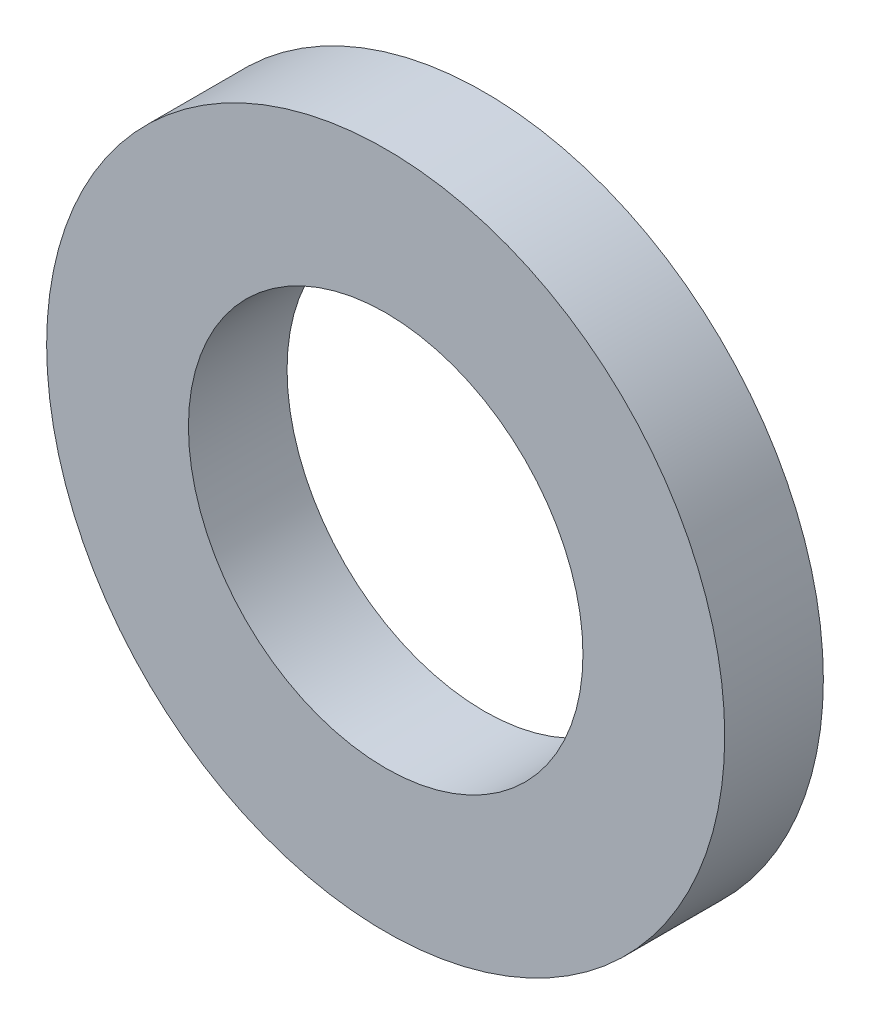
ISO-10303-21;
HEADER;
FILE_DESCRIPTION(('STEP AP214'),'2;1');
FILE_NAME('part.step','',(''),(''),'','','');
FILE_SCHEMA(('AUTOMOTIVE_DESIGN { 1 0 10303 214 1 1 1 1 }'));
ENDSEC;
DATA;
#1=APPLICATION_CONTEXT('core data for automotive mechanical design processes');
#2=APPLICATION_PROTOCOL_DEFINITION('international standard','automotive_design',2000,#1);
#3=PRODUCT_CONTEXT('',#1,'mechanical');
#4=PRODUCT('Part','Part','',(#3));
#5=PRODUCT_RELATED_PRODUCT_CATEGORY('part','',(#4));
#6=PRODUCT_DEFINITION_FORMATION('','',#4);
#7=PRODUCT_DEFINITION_CONTEXT('part definition',#1,'design');
#8=PRODUCT_DEFINITION('design','',#6,#7);
#9=PRODUCT_DEFINITION_SHAPE('','',#8);
#10=(LENGTH_UNIT() NAMED_UNIT(*) SI_UNIT(.MILLI.,.METRE.));
#11=(NAMED_UNIT(*) PLANE_ANGLE_UNIT() SI_UNIT($,.RADIAN.));
#12=(NAMED_UNIT(*) SI_UNIT($,.STERADIAN.) SOLID_ANGLE_UNIT());
#13=UNCERTAINTY_MEASURE_WITH_UNIT(LENGTH_MEASURE(1.E-05),#10,'distance_accuracy_value','');
#14=(GEOMETRIC_REPRESENTATION_CONTEXT(3) GLOBAL_UNCERTAINTY_ASSIGNED_CONTEXT((#13)) GLOBAL_UNIT_ASSIGNED_CONTEXT((#10,
#11,#12)) REPRESENTATION_CONTEXT('',''));
#15=CARTESIAN_POINT('',(0.,0.,0.));
#16=DIRECTION('',(0.,0.,1.));
#17=DIRECTION('',(1.,0.,0.));
#18=AXIS2_PLACEMENT_3D('',#15,#16,#17);
#19=CARTESIAN_POINT('',(0.,0.,0.8));
#20=DIRECTION('',(0.,0.,1.));
#21=DIRECTION('',(1.,0.,0.));
#22=AXIS2_PLACEMENT_3D('',#19,#20,#21);
#23=PLANE('',#22);
#24=CARTESIAN_POINT('',(0.,0.,0.8));
#25=DIRECTION('',(0.,0.,1.));
#26=DIRECTION('',(1.,0.,0.));
#27=AXIS2_PLACEMENT_3D('',#24,#25,#26);
#28=CIRCLE('',#27,2.75);
#29=CARTESIAN_POINT('',(2.75,0.,0.8));
#30=VERTEX_POINT('',#29);
#31=EDGE_CURVE('E10',#30,#30,#28,.T.);
#32=ORIENTED_EDGE('',*,*,#31,.T.);
#33=EDGE_LOOP('',(#32));
#34=FACE_BOUND('',#33,.T.);
#35=CARTESIAN_POINT('',(0.,0.,0.8));
#36=DIRECTION('',(0.,0.,1.));
#37=DIRECTION('',(1.,0.,0.));
#38=AXIS2_PLACEMENT_3D('',#35,#36,#37);
#39=CIRCLE('',#38,1.6);
#40=CARTESIAN_POINT('',(1.6,0.,0.8));
#41=VERTEX_POINT('',#40);
#42=EDGE_CURVE('E56',#41,#41,#39,.T.);
#43=ORIENTED_EDGE('',*,*,#42,.F.);
#44=EDGE_LOOP('',(#43));
#45=FACE_BOUND('',#44,.T.);
#46=ADVANCED_FACE('F43',(#34,#45),#23,.T.);
#47=CARTESIAN_POINT('',(0.,0.,0.));
#48=DIRECTION('',(0.,0.,1.));
#49=DIRECTION('',(1.,0.,0.));
#50=AXIS2_PLACEMENT_3D('',#47,#48,#49);
#51=PLANE('',#50);
#52=CARTESIAN_POINT('',(0.,0.,0.));
#53=DIRECTION('',(0.,0.,1.));
#54=DIRECTION('',(1.,0.,0.));
#55=AXIS2_PLACEMENT_3D('',#52,#53,#54);
#56=CIRCLE('',#55,2.75);
#57=CARTESIAN_POINT('',(2.75,0.,0.));
#58=VERTEX_POINT('',#57);
#59=EDGE_CURVE('E47',#58,#58,#56,.T.);
#60=ORIENTED_EDGE('',*,*,#59,.F.);
#61=EDGE_LOOP('',(#60));
#62=FACE_BOUND('',#61,.T.);
#63=CARTESIAN_POINT('',(0.,0.,0.));
#64=DIRECTION('',(0.,0.,1.));
#65=DIRECTION('',(1.,0.,0.));
#66=AXIS2_PLACEMENT_3D('',#63,#64,#65);
#67=CIRCLE('',#66,1.6);
#68=CARTESIAN_POINT('',(1.6,0.,0.));
#69=VERTEX_POINT('',#68);
#70=EDGE_CURVE('E58',#69,#69,#67,.T.);
#71=ORIENTED_EDGE('',*,*,#70,.T.);
#72=EDGE_LOOP('',(#71));
#73=FACE_BOUND('',#72,.T.);
#74=ADVANCED_FACE('F70',(#62,#73),#51,.F.);
#75=CARTESIAN_POINT('',(0.,0.,0.8));
#76=DIRECTION('',(0.,0.,-1.));
#77=DIRECTION('',(-1.,0.,0.));
#78=AXIS2_PLACEMENT_3D('',#75,#76,#77);
#79=CYLINDRICAL_SURFACE('',#78,2.75);
#80=ORIENTED_EDGE('',*,*,#31,.F.);
#81=EDGE_LOOP('',(#80));
#82=FACE_BOUND('',#81,.T.);
#83=ORIENTED_EDGE('',*,*,#59,.T.);
#84=EDGE_LOOP('',(#83));
#85=FACE_BOUND('',#84,.T.);
#86=ADVANCED_FACE('F45',(#82,#85),#79,.T.);
#87=CARTESIAN_POINT('',(0.,0.,0.8));
#88=DIRECTION('',(0.,0.,-1.));
#89=DIRECTION('',(-1.,0.,0.));
#90=AXIS2_PLACEMENT_3D('',#87,#88,#89);
#91=CYLINDRICAL_SURFACE('',#90,1.6);
#92=ORIENTED_EDGE('',*,*,#42,.T.);
#93=EDGE_LOOP('',(#92));
#94=FACE_BOUND('',#93,.T.);
#95=ORIENTED_EDGE('',*,*,#70,.F.);
#96=EDGE_LOOP('',(#95));
#97=FACE_BOUND('',#96,.T.);
#98=ADVANCED_FACE('F66',(#94,#97),#91,.F.);
#99=CLOSED_SHELL('',(#46,#74,#86,#98));
#100=MANIFOLD_SOLID_BREP('B2',#99);
#101=ADVANCED_BREP_SHAPE_REPRESENTATION('',(#18,#100),#14);
#102=SHAPE_DEFINITION_REPRESENTATION(#9,#101);
ENDSEC;
END-ISO-10303-21;
